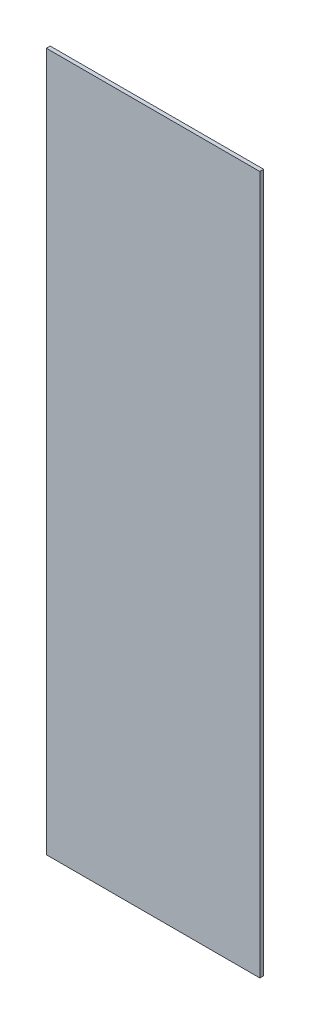
ISO-10303-21;
HEADER;
FILE_DESCRIPTION(('STEP AP214'),'2;1');
FILE_NAME('part.step','',(''),(''),'','','');
FILE_SCHEMA(('AUTOMOTIVE_DESIGN { 1 0 10303 214 1 1 1 1 }'));
ENDSEC;
DATA;
#1=APPLICATION_CONTEXT('core data for automotive mechanical design processes');
#2=APPLICATION_PROTOCOL_DEFINITION('international standard','automotive_design',2000,#1);
#3=PRODUCT_CONTEXT('',#1,'mechanical');
#4=PRODUCT('Part','Part','',(#3));
#5=PRODUCT_RELATED_PRODUCT_CATEGORY('part','',(#4));
#6=PRODUCT_DEFINITION_FORMATION('','',#4);
#7=PRODUCT_DEFINITION_CONTEXT('part definition',#1,'design');
#8=PRODUCT_DEFINITION('design','',#6,#7);
#9=PRODUCT_DEFINITION_SHAPE('','',#8);
#10=(LENGTH_UNIT() NAMED_UNIT(*) SI_UNIT(.MILLI.,.METRE.));
#11=(NAMED_UNIT(*) PLANE_ANGLE_UNIT() SI_UNIT($,.RADIAN.));
#12=(NAMED_UNIT(*) SI_UNIT($,.STERADIAN.) SOLID_ANGLE_UNIT());
#13=UNCERTAINTY_MEASURE_WITH_UNIT(LENGTH_MEASURE(1.E-05),#10,'distance_accuracy_value','');
#14=(GEOMETRIC_REPRESENTATION_CONTEXT(3) GLOBAL_UNCERTAINTY_ASSIGNED_CONTEXT((#13)) GLOBAL_UNIT_ASSIGNED_CONTEXT((#10,
#11,#12)) REPRESENTATION_CONTEXT('',''));
#15=CARTESIAN_POINT('',(0.,0.,0.));
#16=DIRECTION('',(0.,0.,1.));
#17=DIRECTION('',(1.,0.,0.));
#18=AXIS2_PLACEMENT_3D('',#15,#16,#17);
#19=CARTESIAN_POINT('',(49.7355,0.,0.));
#20=DIRECTION('',(1.,0.,0.));
#21=DIRECTION('',(0.,0.,-1.));
#22=AXIS2_PLACEMENT_3D('',#19,#20,#21);
#23=PLANE('',#22);
#24=DIRECTION('',(0.,1.,0.));
#25=VECTOR('',#24,1.);
#26=CARTESIAN_POINT('',(49.7355,0.,0.));
#27=LINE('',#26,#25);
#28=CARTESIAN_POINT('',(49.7355,-162.705,0.));
#29=VERTEX_POINT('',#28);
#30=CARTESIAN_POINT('',(49.7355,162.705,0.));
#31=VERTEX_POINT('',#30);
#32=EDGE_CURVE('E74',#29,#31,#27,.T.);
#33=ORIENTED_EDGE('',*,*,#32,.T.);
#34=DIRECTION('',(0.,0.,-1.));
#35=VECTOR('',#34,1.);
#36=CARTESIAN_POINT('',(49.7355,162.705,0.));
#37=LINE('',#36,#35);
#38=CARTESIAN_POINT('',(49.7355,162.705,1.786));
#39=VERTEX_POINT('',#38);
#40=EDGE_CURVE('E60',#31,#39,#37,.F.);
#41=ORIENTED_EDGE('',*,*,#40,.T.);
#42=DIRECTION('',(0.,1.,0.));
#43=VECTOR('',#42,1.);
#44=CARTESIAN_POINT('',(49.7355,0.,1.786));
#45=LINE('',#44,#43);
#46=CARTESIAN_POINT('',(49.7355,-162.705,1.786));
#47=VERTEX_POINT('',#46);
#48=EDGE_CURVE('E20',#39,#47,#45,.F.);
#49=ORIENTED_EDGE('',*,*,#48,.T.);
#50=DIRECTION('',(0.,0.,1.));
#51=VECTOR('',#50,1.);
#52=CARTESIAN_POINT('',(49.7355,-162.705,0.));
#53=LINE('',#52,#51);
#54=EDGE_CURVE('E55',#47,#29,#53,.F.);
#55=ORIENTED_EDGE('',*,*,#54,.T.);
#56=EDGE_LOOP('',(#33,#41,#49,#55));
#57=FACE_BOUND('',#56,.T.);
#58=ADVANCED_FACE('F17',(#57),#23,.T.);
#59=CARTESIAN_POINT('',(0.,0.,1.786));
#60=DIRECTION('',(0.,0.,1.));
#61=DIRECTION('',(1.,0.,0.));
#62=AXIS2_PLACEMENT_3D('',#59,#60,#61);
#63=PLANE('',#62);
#64=DIRECTION('',(1.,0.,0.));
#65=VECTOR('',#64,1.);
#66=CARTESIAN_POINT('',(0.,-162.705,1.786));
#67=LINE('',#66,#65);
#68=CARTESIAN_POINT('',(-49.7355,-162.705,1.786));
#69=VERTEX_POINT('',#68);
#70=EDGE_CURVE('E63',#69,#47,#67,.T.);
#71=ORIENTED_EDGE('',*,*,#70,.T.);
#72=ORIENTED_EDGE('',*,*,#48,.F.);
#73=DIRECTION('',(1.,0.,0.));
#74=VECTOR('',#73,1.);
#75=CARTESIAN_POINT('',(0.,162.705,1.786));
#76=LINE('',#75,#74);
#77=CARTESIAN_POINT('',(-49.7355,162.705,1.786));
#78=VERTEX_POINT('',#77);
#79=EDGE_CURVE('E78',#39,#78,#76,.F.);
#80=ORIENTED_EDGE('',*,*,#79,.T.);
#81=DIRECTION('',(0.,1.,0.));
#82=VECTOR('',#81,1.);
#83=CARTESIAN_POINT('',(-49.7355,0.,1.786));
#84=LINE('',#83,#82);
#85=EDGE_CURVE('E67',#78,#69,#84,.F.);
#86=ORIENTED_EDGE('',*,*,#85,.T.);
#87=EDGE_LOOP('',(#71,#72,#80,#86));
#88=FACE_BOUND('',#87,.T.);
#89=ADVANCED_FACE('F65',(#88),#63,.T.);
#90=CARTESIAN_POINT('',(0.,-162.705,0.));
#91=DIRECTION('',(0.,1.,0.));
#92=DIRECTION('',(0.,0.,1.));
#93=AXIS2_PLACEMENT_3D('',#90,#91,#92);
#94=PLANE('',#93);
#95=DIRECTION('',(1.,0.,0.));
#96=VECTOR('',#95,1.);
#97=CARTESIAN_POINT('',(0.,-162.705,0.));
#98=LINE('',#97,#96);
#99=CARTESIAN_POINT('',(-49.7355,-162.705,0.));
#100=VERTEX_POINT('',#99);
#101=EDGE_CURVE('E71',#100,#29,#98,.T.);
#102=ORIENTED_EDGE('',*,*,#101,.T.);
#103=ORIENTED_EDGE('',*,*,#54,.F.);
#104=ORIENTED_EDGE('',*,*,#70,.F.);
#105=DIRECTION('',(0.,0.,1.));
#106=VECTOR('',#105,1.);
#107=CARTESIAN_POINT('',(-49.7355,-162.705,0.));
#108=LINE('',#107,#106);
#109=EDGE_CURVE('E84',#69,#100,#108,.F.);
#110=ORIENTED_EDGE('',*,*,#109,.T.);
#111=EDGE_LOOP('',(#102,#103,#104,#110));
#112=FACE_BOUND('',#111,.T.);
#113=ADVANCED_FACE('F70',(#112),#94,.F.);
#114=CARTESIAN_POINT('',(0.,0.,0.));
#115=DIRECTION('',(0.,0.,1.));
#116=DIRECTION('',(1.,0.,0.));
#117=AXIS2_PLACEMENT_3D('',#114,#115,#116);
#118=PLANE('',#117);
#119=ORIENTED_EDGE('',*,*,#32,.F.);
#120=ORIENTED_EDGE('',*,*,#101,.F.);
#121=DIRECTION('',(0.,1.,0.));
#122=VECTOR('',#121,1.);
#123=CARTESIAN_POINT('',(-49.7355,0.,0.));
#124=LINE('',#123,#122);
#125=CARTESIAN_POINT('',(-49.7355,162.705,0.));
#126=VERTEX_POINT('',#125);
#127=EDGE_CURVE('E26',#100,#126,#124,.T.);
#128=ORIENTED_EDGE('',*,*,#127,.T.);
#129=DIRECTION('',(1.,0.,0.));
#130=VECTOR('',#129,1.);
#131=CARTESIAN_POINT('',(0.,162.705,0.));
#132=LINE('',#131,#130);
#133=EDGE_CURVE('E80',#126,#31,#132,.T.);
#134=ORIENTED_EDGE('',*,*,#133,.T.);
#135=EDGE_LOOP('',(#119,#120,#128,#134));
#136=FACE_BOUND('',#135,.T.);
#137=ADVANCED_FACE('F87',(#136),#118,.F.);
#138=CARTESIAN_POINT('',(0.,162.705,0.));
#139=DIRECTION('',(0.,-1.,0.));
#140=DIRECTION('',(0.,0.,-1.));
#141=AXIS2_PLACEMENT_3D('',#138,#139,#140);
#142=PLANE('',#141);
#143=ORIENTED_EDGE('',*,*,#133,.F.);
#144=DIRECTION('',(0.,0.,1.));
#145=VECTOR('',#144,1.);
#146=CARTESIAN_POINT('',(-49.7355,162.705,0.));
#147=LINE('',#146,#145);
#148=EDGE_CURVE('E11',#126,#78,#147,.T.);
#149=ORIENTED_EDGE('',*,*,#148,.T.);
#150=ORIENTED_EDGE('',*,*,#79,.F.);
#151=ORIENTED_EDGE('',*,*,#40,.F.);
#152=EDGE_LOOP('',(#143,#149,#150,#151));
#153=FACE_BOUND('',#152,.T.);
#154=ADVANCED_FACE('F91',(#153),#142,.F.);
#155=CARTESIAN_POINT('',(-49.7355,0.,0.));
#156=DIRECTION('',(-1.,0.,0.));
#157=DIRECTION('',(0.,0.,1.));
#158=AXIS2_PLACEMENT_3D('',#155,#156,#157);
#159=PLANE('',#158);
#160=ORIENTED_EDGE('',*,*,#127,.F.);
#161=ORIENTED_EDGE('',*,*,#109,.F.);
#162=ORIENTED_EDGE('',*,*,#85,.F.);
#163=ORIENTED_EDGE('',*,*,#148,.F.);
#164=EDGE_LOOP('',(#160,#161,#162,#163));
#165=FACE_BOUND('',#164,.T.);
#166=ADVANCED_FACE('F89',(#165),#159,.T.);
#167=CLOSED_SHELL('',(#58,#89,#113,#137,#154,#166));
#168=MANIFOLD_SOLID_BREP('B1',#167);
#169=ADVANCED_BREP_SHAPE_REPRESENTATION('',(#18,#168),#14);
#170=SHAPE_DEFINITION_REPRESENTATION(#9,#169);
ENDSEC;
END-ISO-10303-21;
